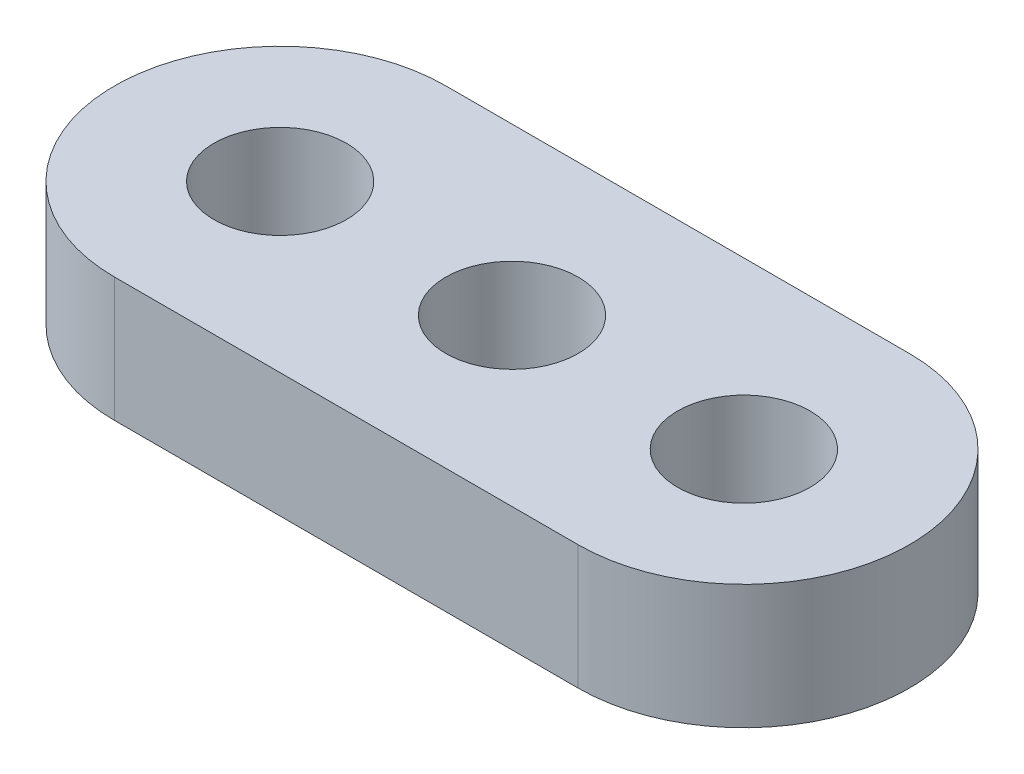
ISO-10303-21;
HEADER;
FILE_DESCRIPTION(('STEP AP214'),'2;1');
FILE_NAME('part.step','',(''),(''),'','','');
FILE_SCHEMA(('AUTOMOTIVE_DESIGN { 1 0 10303 214 1 1 1 1 }'));
ENDSEC;
DATA;
#1=APPLICATION_CONTEXT('core data for automotive mechanical design processes');
#2=APPLICATION_PROTOCOL_DEFINITION('international standard','automotive_design',2000,#1);
#3=PRODUCT_CONTEXT('',#1,'mechanical');
#4=PRODUCT('Part','Part','',(#3));
#5=PRODUCT_RELATED_PRODUCT_CATEGORY('part','',(#4));
#6=PRODUCT_DEFINITION_FORMATION('','',#4);
#7=PRODUCT_DEFINITION_CONTEXT('part definition',#1,'design');
#8=PRODUCT_DEFINITION('design','',#6,#7);
#9=PRODUCT_DEFINITION_SHAPE('','',#8);
#10=(LENGTH_UNIT() NAMED_UNIT(*) SI_UNIT(.MILLI.,.METRE.));
#11=(NAMED_UNIT(*) PLANE_ANGLE_UNIT() SI_UNIT($,.RADIAN.));
#12=(NAMED_UNIT(*) SI_UNIT($,.STERADIAN.) SOLID_ANGLE_UNIT());
#13=UNCERTAINTY_MEASURE_WITH_UNIT(LENGTH_MEASURE(1.E-05),#10,'distance_accuracy_value','');
#14=(GEOMETRIC_REPRESENTATION_CONTEXT(3) GLOBAL_UNCERTAINTY_ASSIGNED_CONTEXT((#13)) GLOBAL_UNIT_ASSIGNED_CONTEXT((#10,
#11,#12)) REPRESENTATION_CONTEXT('',''));
#15=CARTESIAN_POINT('',(0.,0.,0.));
#16=DIRECTION('',(0.,0.,1.));
#17=DIRECTION('',(1.,0.,0.));
#18=AXIS2_PLACEMENT_3D('',#15,#16,#17);
#19=CARTESIAN_POINT('',(-5.6,3.,0.));
#20=DIRECTION('',(0.,1.,0.));
#21=DIRECTION('',(0.,0.,-1.));
#22=AXIS2_PLACEMENT_3D('',#19,#20,#21);
#23=PLANE('',#22);
#24=CARTESIAN_POINT('',(5.6,3.,0.));
#25=DIRECTION('',(0.,-1.,0.));
#26=DIRECTION('',(0.,0.,-1.));
#27=AXIS2_PLACEMENT_3D('',#24,#25,#26);
#28=CIRCLE('',#27,1.6);
#29=CARTESIAN_POINT('',(5.6,3.,-1.6));
#30=VERTEX_POINT('',#29);
#31=EDGE_CURVE('E116',#30,#30,#28,.T.);
#32=ORIENTED_EDGE('',*,*,#31,.T.);
#33=EDGE_LOOP('',(#32));
#34=FACE_BOUND('',#33,.T.);
#35=CARTESIAN_POINT('',(-5.6,3.,0.));
#36=DIRECTION('',(0.,-1.,0.));
#37=DIRECTION('',(0.,0.,-1.));
#38=AXIS2_PLACEMENT_3D('',#35,#36,#37);
#39=CIRCLE('',#38,4.);
#40=CARTESIAN_POINT('',(-5.6,3.,4.));
#41=VERTEX_POINT('',#40);
#42=CARTESIAN_POINT('',(-5.6,3.,-4.));
#43=VERTEX_POINT('',#42);
#44=EDGE_CURVE('E93',#41,#43,#39,.T.);
#45=ORIENTED_EDGE('',*,*,#44,.F.);
#46=DIRECTION('',(-1.,0.,0.));
#47=VECTOR('',#46,1.);
#48=CARTESIAN_POINT('',(-5.6,3.,4.));
#49=LINE('',#48,#47);
#50=CARTESIAN_POINT('',(5.6,3.,4.));
#51=VERTEX_POINT('',#50);
#52=EDGE_CURVE('E96',#51,#41,#49,.T.);
#53=ORIENTED_EDGE('',*,*,#52,.F.);
#54=CARTESIAN_POINT('',(5.6,3.,0.));
#55=DIRECTION('',(0.,-1.,0.));
#56=DIRECTION('',(0.,0.,-1.));
#57=AXIS2_PLACEMENT_3D('',#54,#55,#56);
#58=CIRCLE('',#57,4.);
#59=CARTESIAN_POINT('',(5.6,3.,-4.));
#60=VERTEX_POINT('',#59);
#61=EDGE_CURVE('E84',#60,#51,#58,.T.);
#62=ORIENTED_EDGE('',*,*,#61,.F.);
#63=DIRECTION('',(1.,0.,0.));
#64=VECTOR('',#63,1.);
#65=CARTESIAN_POINT('',(-5.6,3.,-4.));
#66=LINE('',#65,#64);
#67=EDGE_CURVE('E89',#43,#60,#66,.T.);
#68=ORIENTED_EDGE('',*,*,#67,.F.);
#69=EDGE_LOOP('',(#45,#53,#62,#68));
#70=FACE_BOUND('',#69,.T.);
#71=CARTESIAN_POINT('',(-5.6,3.,0.));
#72=DIRECTION('',(0.,-1.,0.));
#73=DIRECTION('',(0.,0.,-1.));
#74=AXIS2_PLACEMENT_3D('',#71,#72,#73);
#75=CIRCLE('',#74,1.6);
#76=CARTESIAN_POINT('',(-5.6,3.,-1.6));
#77=VERTEX_POINT('',#76);
#78=EDGE_CURVE('E105',#77,#77,#75,.T.);
#79=ORIENTED_EDGE('',*,*,#78,.T.);
#80=EDGE_LOOP('',(#79));
#81=FACE_BOUND('',#80,.T.);
#82=CARTESIAN_POINT('',(0.,3.,0.));
#83=DIRECTION('',(0.,-1.,0.));
#84=DIRECTION('',(0.,0.,-1.));
#85=AXIS2_PLACEMENT_3D('',#82,#83,#84);
#86=CIRCLE('',#85,1.6);
#87=CARTESIAN_POINT('',(0.,3.,-1.6));
#88=VERTEX_POINT('',#87);
#89=EDGE_CURVE('E122',#88,#88,#86,.T.);
#90=ORIENTED_EDGE('',*,*,#89,.T.);
#91=EDGE_LOOP('',(#90));
#92=FACE_BOUND('',#91,.T.);
#93=ADVANCED_FACE('F37',(#34,#70,#81,#92),#23,.T.);
#94=CARTESIAN_POINT('',(-5.6,0.,0.));
#95=DIRECTION('',(0.,1.,0.));
#96=DIRECTION('',(0.,0.,-1.));
#97=AXIS2_PLACEMENT_3D('',#94,#95,#96);
#98=PLANE('',#97);
#99=CARTESIAN_POINT('',(-5.6,0.,0.));
#100=DIRECTION('',(0.,-1.,0.));
#101=DIRECTION('',(0.,0.,-1.));
#102=AXIS2_PLACEMENT_3D('',#99,#100,#101);
#103=CIRCLE('',#102,4.);
#104=CARTESIAN_POINT('',(-5.6,0.,4.));
#105=VERTEX_POINT('',#104);
#106=CARTESIAN_POINT('',(-5.6,0.,-4.));
#107=VERTEX_POINT('',#106);
#108=EDGE_CURVE('E101',#105,#107,#103,.T.);
#109=ORIENTED_EDGE('',*,*,#108,.T.);
#110=DIRECTION('',(1.,0.,0.));
#111=VECTOR('',#110,1.);
#112=CARTESIAN_POINT('',(-5.6,0.,-4.));
#113=LINE('',#112,#111);
#114=CARTESIAN_POINT('',(5.6,0.,-4.));
#115=VERTEX_POINT('',#114);
#116=EDGE_CURVE('E104',#107,#115,#113,.T.);
#117=ORIENTED_EDGE('',*,*,#116,.T.);
#118=CARTESIAN_POINT('',(5.6,0.,0.));
#119=DIRECTION('',(0.,-1.,0.));
#120=DIRECTION('',(0.,0.,-1.));
#121=AXIS2_PLACEMENT_3D('',#118,#119,#120);
#122=CIRCLE('',#121,4.);
#123=CARTESIAN_POINT('',(5.6,0.,4.));
#124=VERTEX_POINT('',#123);
#125=EDGE_CURVE('E87',#115,#124,#122,.T.);
#126=ORIENTED_EDGE('',*,*,#125,.T.);
#127=DIRECTION('',(-1.,0.,0.));
#128=VECTOR('',#127,1.);
#129=CARTESIAN_POINT('',(-5.6,0.,4.));
#130=LINE('',#129,#128);
#131=EDGE_CURVE('E108',#124,#105,#130,.T.);
#132=ORIENTED_EDGE('',*,*,#131,.T.);
#133=EDGE_LOOP('',(#109,#117,#126,#132));
#134=FACE_BOUND('',#133,.T.);
#135=CARTESIAN_POINT('',(-5.6,0.,0.));
#136=DIRECTION('',(0.,-1.,0.));
#137=DIRECTION('',(0.,0.,-1.));
#138=AXIS2_PLACEMENT_3D('',#135,#136,#137);
#139=CIRCLE('',#138,1.6);
#140=CARTESIAN_POINT('',(-5.6,0.,-1.6));
#141=VERTEX_POINT('',#140);
#142=EDGE_CURVE('E113',#141,#141,#139,.T.);
#143=ORIENTED_EDGE('',*,*,#142,.F.);
#144=EDGE_LOOP('',(#143));
#145=FACE_BOUND('',#144,.T.);
#146=CARTESIAN_POINT('',(5.6,0.,0.));
#147=DIRECTION('',(0.,-1.,0.));
#148=DIRECTION('',(0.,0.,-1.));
#149=AXIS2_PLACEMENT_3D('',#146,#147,#148);
#150=CIRCLE('',#149,1.6);
#151=CARTESIAN_POINT('',(5.6,0.,-1.6));
#152=VERTEX_POINT('',#151);
#153=EDGE_CURVE('E119',#152,#152,#150,.T.);
#154=ORIENTED_EDGE('',*,*,#153,.F.);
#155=EDGE_LOOP('',(#154));
#156=FACE_BOUND('',#155,.T.);
#157=CARTESIAN_POINT('',(0.,0.,0.));
#158=DIRECTION('',(0.,-1.,0.));
#159=DIRECTION('',(0.,0.,-1.));
#160=AXIS2_PLACEMENT_3D('',#157,#158,#159);
#161=CIRCLE('',#160,1.6);
#162=CARTESIAN_POINT('',(0.,0.,-1.6));
#163=VERTEX_POINT('',#162);
#164=EDGE_CURVE('E125',#163,#163,#161,.T.);
#165=ORIENTED_EDGE('',*,*,#164,.F.);
#166=EDGE_LOOP('',(#165));
#167=FACE_BOUND('',#166,.T.);
#168=ADVANCED_FACE('F139',(#134,#145,#156,#167),#98,.F.);
#169=CARTESIAN_POINT('',(-5.6,3.,0.));
#170=DIRECTION('',(0.,-1.,0.));
#171=DIRECTION('',(0.,0.,1.));
#172=AXIS2_PLACEMENT_3D('',#169,#170,#171);
#173=CYLINDRICAL_SURFACE('',#172,4.);
#174=ORIENTED_EDGE('',*,*,#108,.F.);
#175=DIRECTION('',(0.,-1.,0.));
#176=VECTOR('',#175,1.);
#177=CARTESIAN_POINT('',(-5.6,3.,4.));
#178=LINE('',#177,#176);
#179=EDGE_CURVE('E54',#41,#105,#178,.T.);
#180=ORIENTED_EDGE('',*,*,#179,.F.);
#181=ORIENTED_EDGE('',*,*,#44,.T.);
#182=DIRECTION('',(0.,-1.,0.));
#183=VECTOR('',#182,1.);
#184=CARTESIAN_POINT('',(-5.6,3.,-4.));
#185=LINE('',#184,#183);
#186=EDGE_CURVE('E11',#43,#107,#185,.T.);
#187=ORIENTED_EDGE('',*,*,#186,.T.);
#188=EDGE_LOOP('',(#174,#180,#181,#187));
#189=FACE_BOUND('',#188,.T.);
#190=ADVANCED_FACE('F39',(#189),#173,.T.);
#191=CARTESIAN_POINT('',(-5.6,3.,-4.));
#192=DIRECTION('',(0.,0.,1.));
#193=DIRECTION('',(-1.,0.,0.));
#194=AXIS2_PLACEMENT_3D('',#191,#192,#193);
#195=PLANE('',#194);
#196=ORIENTED_EDGE('',*,*,#116,.F.);
#197=ORIENTED_EDGE('',*,*,#186,.F.);
#198=ORIENTED_EDGE('',*,*,#67,.T.);
#199=DIRECTION('',(0.,-1.,0.));
#200=VECTOR('',#199,1.);
#201=CARTESIAN_POINT('',(5.6,3.,-4.));
#202=LINE('',#201,#200);
#203=EDGE_CURVE('E46',#60,#115,#202,.T.);
#204=ORIENTED_EDGE('',*,*,#203,.T.);
#205=EDGE_LOOP('',(#196,#197,#198,#204));
#206=FACE_BOUND('',#205,.T.);
#207=ADVANCED_FACE('F90',(#206),#195,.F.);
#208=CARTESIAN_POINT('',(5.6,3.,0.));
#209=DIRECTION('',(0.,-1.,0.));
#210=DIRECTION('',(0.,0.,1.));
#211=AXIS2_PLACEMENT_3D('',#208,#209,#210);
#212=CYLINDRICAL_SURFACE('',#211,4.);
#213=ORIENTED_EDGE('',*,*,#125,.F.);
#214=ORIENTED_EDGE('',*,*,#203,.F.);
#215=ORIENTED_EDGE('',*,*,#61,.T.);
#216=DIRECTION('',(0.,-1.,0.));
#217=VECTOR('',#216,1.);
#218=CARTESIAN_POINT('',(5.6,3.,4.));
#219=LINE('',#218,#217);
#220=EDGE_CURVE('E70',#51,#124,#219,.T.);
#221=ORIENTED_EDGE('',*,*,#220,.T.);
#222=EDGE_LOOP('',(#213,#214,#215,#221));
#223=FACE_BOUND('',#222,.T.);
#224=ADVANCED_FACE('F82',(#223),#212,.T.);
#225=CARTESIAN_POINT('',(-5.6,3.,4.));
#226=DIRECTION('',(0.,0.,-1.));
#227=DIRECTION('',(1.,0.,0.));
#228=AXIS2_PLACEMENT_3D('',#225,#226,#227);
#229=PLANE('',#228);
#230=ORIENTED_EDGE('',*,*,#131,.F.);
#231=ORIENTED_EDGE('',*,*,#220,.F.);
#232=ORIENTED_EDGE('',*,*,#52,.T.);
#233=ORIENTED_EDGE('',*,*,#179,.T.);
#234=EDGE_LOOP('',(#230,#231,#232,#233));
#235=FACE_BOUND('',#234,.T.);
#236=ADVANCED_FACE('F151',(#235),#229,.F.);
#237=CARTESIAN_POINT('',(-5.6,3.,0.));
#238=DIRECTION('',(0.,-1.,0.));
#239=DIRECTION('',(0.,0.,1.));
#240=AXIS2_PLACEMENT_3D('',#237,#238,#239);
#241=CYLINDRICAL_SURFACE('',#240,1.6);
#242=ORIENTED_EDGE('',*,*,#78,.F.);
#243=EDGE_LOOP('',(#242));
#244=FACE_BOUND('',#243,.T.);
#245=ORIENTED_EDGE('',*,*,#142,.T.);
#246=EDGE_LOOP('',(#245));
#247=FACE_BOUND('',#246,.T.);
#248=ADVANCED_FACE('F154',(#244,#247),#241,.F.);
#249=CARTESIAN_POINT('',(5.6,3.,0.));
#250=DIRECTION('',(0.,-1.,0.));
#251=DIRECTION('',(0.,0.,1.));
#252=AXIS2_PLACEMENT_3D('',#249,#250,#251);
#253=CYLINDRICAL_SURFACE('',#252,1.6);
#254=ORIENTED_EDGE('',*,*,#31,.F.);
#255=EDGE_LOOP('',(#254));
#256=FACE_BOUND('',#255,.T.);
#257=ORIENTED_EDGE('',*,*,#153,.T.);
#258=EDGE_LOOP('',(#257));
#259=FACE_BOUND('',#258,.T.);
#260=ADVANCED_FACE('F135',(#256,#259),#253,.F.);
#261=CARTESIAN_POINT('',(0.,3.,0.));
#262=DIRECTION('',(0.,-1.,0.));
#263=DIRECTION('',(0.,0.,1.));
#264=AXIS2_PLACEMENT_3D('',#261,#262,#263);
#265=CYLINDRICAL_SURFACE('',#264,1.6);
#266=ORIENTED_EDGE('',*,*,#89,.F.);
#267=EDGE_LOOP('',(#266));
#268=FACE_BOUND('',#267,.T.);
#269=ORIENTED_EDGE('',*,*,#164,.T.);
#270=EDGE_LOOP('',(#269));
#271=FACE_BOUND('',#270,.T.);
#272=ADVANCED_FACE('F132',(#268,#271),#265,.F.);
#273=CLOSED_SHELL('',(#93,#168,#190,#207,#224,#236,#248,#260,#272));
#274=MANIFOLD_SOLID_BREP('B2',#273);
#275=ADVANCED_BREP_SHAPE_REPRESENTATION('',(#18,#274),#14);
#276=SHAPE_DEFINITION_REPRESENTATION(#9,#275);
ENDSEC;
END-ISO-10303-21;
